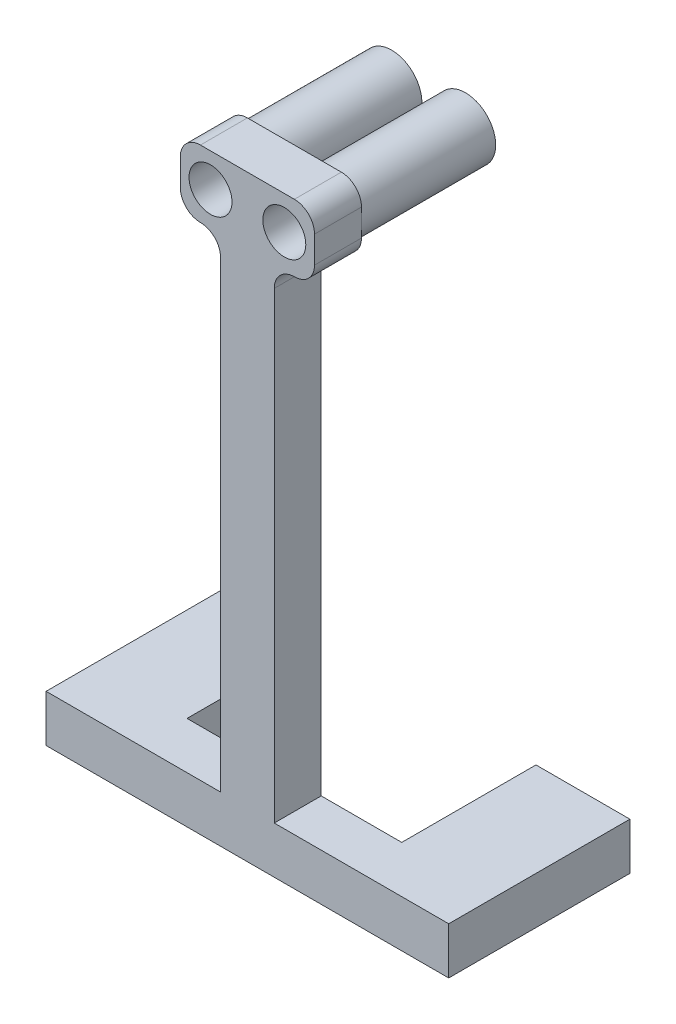
ISO-10303-21;
HEADER;
FILE_DESCRIPTION(('STEP AP214'),'2;1');
FILE_NAME('part.step','',(''),(''),'','','');
FILE_SCHEMA(('AUTOMOTIVE_DESIGN { 1 0 10303 214 1 1 1 1 }'));
ENDSEC;
DATA;
#1=APPLICATION_CONTEXT('core data for automotive mechanical design processes');
#2=APPLICATION_PROTOCOL_DEFINITION('international standard','automotive_design',2000,#1);
#3=PRODUCT_CONTEXT('',#1,'mechanical');
#4=PRODUCT('Part','Part','',(#3));
#5=PRODUCT_RELATED_PRODUCT_CATEGORY('part','',(#4));
#6=PRODUCT_DEFINITION_FORMATION('','',#4);
#7=PRODUCT_DEFINITION_CONTEXT('part definition',#1,'design');
#8=PRODUCT_DEFINITION('design','',#6,#7);
#9=PRODUCT_DEFINITION_SHAPE('','',#8);
#10=(LENGTH_UNIT() NAMED_UNIT(*) SI_UNIT(.MILLI.,.METRE.));
#11=(NAMED_UNIT(*) PLANE_ANGLE_UNIT() SI_UNIT($,.RADIAN.));
#12=(NAMED_UNIT(*) SI_UNIT($,.STERADIAN.) SOLID_ANGLE_UNIT());
#13=UNCERTAINTY_MEASURE_WITH_UNIT(LENGTH_MEASURE(1.E-05),#10,'distance_accuracy_value','');
#14=(GEOMETRIC_REPRESENTATION_CONTEXT(3) GLOBAL_UNCERTAINTY_ASSIGNED_CONTEXT((#13)) GLOBAL_UNIT_ASSIGNED_CONTEXT((#10,
#11,#12)) REPRESENTATION_CONTEXT('',''));
#15=CARTESIAN_POINT('',(0.,0.,0.));
#16=DIRECTION('',(0.,0.,1.));
#17=DIRECTION('',(1.,0.,0.));
#18=AXIS2_PLACEMENT_3D('',#15,#16,#17);
#19=CARTESIAN_POINT('',(0.,0.,0.));
#20=DIRECTION('',(0.,0.,1.));
#21=DIRECTION('',(1.,0.,0.));
#22=AXIS2_PLACEMENT_3D('',#19,#20,#21);
#23=PLANE('',#22);
#24=DIRECTION('',(0.,-1.,0.));
#25=VECTOR('',#24,1.);
#26=CARTESIAN_POINT('',(-20.32,-4.44500000000001,0.));
#27=LINE('',#26,#25);
#28=CARTESIAN_POINT('',(-20.32,4.44499999999999,0.));
#29=VERTEX_POINT('',#28);
#30=CARTESIAN_POINT('',(-20.32,-4.445,0.));
#31=VERTEX_POINT('',#30);
#32=EDGE_CURVE('E204',#29,#31,#27,.T.);
#33=ORIENTED_EDGE('',*,*,#32,.F.);
#34=DIRECTION('',(1.,0.,0.));
#35=VECTOR('',#34,1.);
#36=CARTESIAN_POINT('',(0.,4.445,0.));
#37=LINE('',#36,#35);
#38=CARTESIAN_POINT('',(-5.08000000000001,4.445,0.));
#39=VERTEX_POINT('',#38);
#40=EDGE_CURVE('E302',#29,#39,#37,.T.);
#41=ORIENTED_EDGE('',*,*,#40,.T.);
#42=DIRECTION('',(0.,-1.,0.));
#43=VECTOR('',#42,1.);
#44=CARTESIAN_POINT('',(-5.07999999999999,0.,0.));
#45=LINE('',#44,#43);
#46=CARTESIAN_POINT('',(-5.08000000000002,92.075,0.));
#47=VERTEX_POINT('',#46);
#48=EDGE_CURVE('E299',#47,#39,#45,.T.);
#49=ORIENTED_EDGE('',*,*,#48,.F.);
#50=CARTESIAN_POINT('',(-8.89000000000002,92.075,0.));
#51=DIRECTION('',(0.,0.,1.));
#52=DIRECTION('',(1.,0.,0.));
#53=AXIS2_PLACEMENT_3D('',#50,#51,#52);
#54=CIRCLE('',#53,3.81);
#55=CARTESIAN_POINT('',(-8.89000000000004,95.885,0.));
#56=VERTEX_POINT('',#55);
#57=EDGE_CURVE('E354',#47,#56,#54,.T.);
#58=ORIENTED_EDGE('',*,*,#57,.T.);
#59=CARTESIAN_POINT('',(-8.89000000000004,99.695,0.));
#60=DIRECTION('',(0.,0.,1.));
#61=DIRECTION('',(1.,0.,0.));
#62=AXIS2_PLACEMENT_3D('',#59,#60,#61);
#63=CIRCLE('',#62,3.81);
#64=CARTESIAN_POINT('',(-12.7,99.695,0.));
#65=VERTEX_POINT('',#64);
#66=EDGE_CURVE('E327',#56,#65,#63,.F.);
#67=ORIENTED_EDGE('',*,*,#66,.T.);
#68=DIRECTION('',(0.,-1.,0.));
#69=VECTOR('',#68,1.);
#70=CARTESIAN_POINT('',(-12.7000000000008,0.,0.));
#71=LINE('',#70,#69);
#72=CARTESIAN_POINT('',(-12.7,102.235,0.));
#73=VERTEX_POINT('',#72);
#74=EDGE_CURVE('E296',#73,#65,#71,.T.);
#75=ORIENTED_EDGE('',*,*,#74,.F.);
#76=CARTESIAN_POINT('',(-6.98500000000002,102.235,0.));
#77=DIRECTION('',(0.,0.,-1.));
#78=DIRECTION('',(-1.,0.,0.));
#79=AXIS2_PLACEMENT_3D('',#76,#77,#78);
#80=CIRCLE('',#79,5.71499999999999);
#81=EDGE_CURVE('E248',#73,#73,#80,.T.);
#82=ORIENTED_EDGE('',*,*,#81,.F.);
#83=CARTESIAN_POINT('',(-12.7,104.775,0.));
#84=VERTEX_POINT('',#83);
#85=EDGE_CURVE('E297',#84,#73,#71,.T.);
#86=ORIENTED_EDGE('',*,*,#85,.F.);
#87=CARTESIAN_POINT('',(-8.89,104.775,0.));
#88=DIRECTION('',(0.,0.,1.));
#89=DIRECTION('',(1.,0.,0.));
#90=AXIS2_PLACEMENT_3D('',#87,#88,#89);
#91=CIRCLE('',#90,3.81);
#92=CARTESIAN_POINT('',(-8.89,108.585,0.));
#93=VERTEX_POINT('',#92);
#94=EDGE_CURVE('E321',#84,#93,#91,.F.);
#95=ORIENTED_EDGE('',*,*,#94,.T.);
#96=DIRECTION('',(1.,0.,0.));
#97=VECTOR('',#96,1.);
#98=CARTESIAN_POINT('',(0.,108.585,0.));
#99=LINE('',#98,#97);
#100=CARTESIAN_POINT('',(8.89000000000003,108.585,0.));
#101=VERTEX_POINT('',#100);
#102=EDGE_CURVE('E293',#93,#101,#99,.T.);
#103=ORIENTED_EDGE('',*,*,#102,.T.);
#104=CARTESIAN_POINT('',(8.89000000000003,104.775,0.));
#105=DIRECTION('',(0.,0.,1.));
#106=DIRECTION('',(1.,0.,0.));
#107=AXIS2_PLACEMENT_3D('',#104,#105,#106);
#108=CIRCLE('',#107,3.81);
#109=CARTESIAN_POINT('',(12.7,104.775,0.));
#110=VERTEX_POINT('',#109);
#111=EDGE_CURVE('E323',#101,#110,#108,.F.);
#112=ORIENTED_EDGE('',*,*,#111,.T.);
#113=DIRECTION('',(0.,-1.,0.));
#114=VECTOR('',#113,1.);
#115=CARTESIAN_POINT('',(12.7,0.,0.));
#116=LINE('',#115,#114);
#117=CARTESIAN_POINT('',(12.7,102.235,0.));
#118=VERTEX_POINT('',#117);
#119=EDGE_CURVE('E291',#110,#118,#116,.T.);
#120=ORIENTED_EDGE('',*,*,#119,.T.);
#121=CARTESIAN_POINT('',(6.98499999999998,102.235,0.));
#122=DIRECTION('',(0.,0.,-1.));
#123=DIRECTION('',(-1.,0.,0.));
#124=AXIS2_PLACEMENT_3D('',#121,#122,#123);
#125=CIRCLE('',#124,5.71500000000001);
#126=EDGE_CURVE('E249',#118,#118,#125,.T.);
#127=ORIENTED_EDGE('',*,*,#126,.F.);
#128=CARTESIAN_POINT('',(12.7,99.695,0.));
#129=VERTEX_POINT('',#128);
#130=EDGE_CURVE('E290',#118,#129,#116,.T.);
#131=ORIENTED_EDGE('',*,*,#130,.T.);
#132=CARTESIAN_POINT('',(8.89000000000003,99.695,0.));
#133=DIRECTION('',(0.,0.,1.));
#134=DIRECTION('',(1.,0.,0.));
#135=AXIS2_PLACEMENT_3D('',#132,#133,#134);
#136=CIRCLE('',#135,3.81);
#137=CARTESIAN_POINT('',(8.89000000000003,95.885,0.));
#138=VERTEX_POINT('',#137);
#139=EDGE_CURVE('E325',#129,#138,#136,.F.);
#140=ORIENTED_EDGE('',*,*,#139,.T.);
#141=CARTESIAN_POINT('',(8.88999999999998,92.075,0.));
#142=DIRECTION('',(0.,0.,1.));
#143=DIRECTION('',(1.,0.,0.));
#144=AXIS2_PLACEMENT_3D('',#141,#142,#143);
#145=CIRCLE('',#144,3.81);
#146=CARTESIAN_POINT('',(5.07999999999998,92.075,0.));
#147=VERTEX_POINT('',#146);
#148=EDGE_CURVE('E43',#138,#147,#145,.T.);
#149=ORIENTED_EDGE('',*,*,#148,.T.);
#150=DIRECTION('',(0.,-1.,0.));
#151=VECTOR('',#150,1.);
#152=CARTESIAN_POINT('',(5.08,0.,0.));
#153=LINE('',#152,#151);
#154=CARTESIAN_POINT('',(5.07999999999999,4.445,0.));
#155=VERTEX_POINT('',#154);
#156=EDGE_CURVE('E256',#147,#155,#153,.T.);
#157=ORIENTED_EDGE('',*,*,#156,.T.);
#158=CARTESIAN_POINT('',(20.32,4.445,0.));
#159=VERTEX_POINT('',#158);
#160=EDGE_CURVE('E262',#155,#159,#37,.T.);
#161=ORIENTED_EDGE('',*,*,#160,.T.);
#162=DIRECTION('',(0.,1.,0.));
#163=VECTOR('',#162,1.);
#164=CARTESIAN_POINT('',(20.32,4.44500000000001,0.));
#165=LINE('',#164,#163);
#166=CARTESIAN_POINT('',(20.32,-4.44499999999999,0.));
#167=VERTEX_POINT('',#166);
#168=EDGE_CURVE('E212',#167,#159,#165,.T.);
#169=ORIENTED_EDGE('',*,*,#168,.F.);
#170=DIRECTION('',(1.,0.,0.));
#171=VECTOR('',#170,1.);
#172=CARTESIAN_POINT('',(0.,-4.445,0.));
#173=LINE('',#172,#171);
#174=EDGE_CURVE('E56',#31,#167,#173,.T.);
#175=ORIENTED_EDGE('',*,*,#174,.F.);
#176=EDGE_LOOP('',(#33,#41,#49,#58,#67,#75,#82,#86,#95,#103,#112,#120,#127,#131,#140,#149,#157,
#161,#169,#175));
#177=FACE_BOUND('',#176,.T.);
#178=ADVANCED_FACE('F34',(#177),#23,.F.);
#179=CARTESIAN_POINT('',(5.08,0.,8.89));
#180=DIRECTION('',(1.,0.,0.));
#181=DIRECTION('',(0.,1.,0.));
#182=AXIS2_PLACEMENT_3D('',#179,#180,#181);
#183=PLANE('',#182);
#184=ORIENTED_EDGE('',*,*,#156,.F.);
#185=DIRECTION('',(0.,0.,-1.));
#186=VECTOR('',#185,1.);
#187=CARTESIAN_POINT('',(5.07999999999998,92.075,8.89));
#188=LINE('',#187,#186);
#189=CARTESIAN_POINT('',(5.07999999999998,92.075,8.89));
#190=VERTEX_POINT('',#189);
#191=EDGE_CURVE('E342',#147,#190,#188,.F.);
#192=ORIENTED_EDGE('',*,*,#191,.T.);
#193=DIRECTION('',(0.,-1.,0.));
#194=VECTOR('',#193,1.);
#195=CARTESIAN_POINT('',(5.08,0.,8.89));
#196=LINE('',#195,#194);
#197=CARTESIAN_POINT('',(5.07999999999999,4.445,8.89));
#198=VERTEX_POINT('',#197);
#199=EDGE_CURVE('E259',#190,#198,#196,.T.);
#200=ORIENTED_EDGE('',*,*,#199,.T.);
#201=DIRECTION('',(0.,0.,-1.));
#202=VECTOR('',#201,1.);
#203=CARTESIAN_POINT('',(5.07999999999999,4.445,8.89));
#204=LINE('',#203,#202);
#205=EDGE_CURVE('E288',#198,#155,#204,.T.);
#206=ORIENTED_EDGE('',*,*,#205,.T.);
#207=EDGE_LOOP('',(#184,#192,#200,#206));
#208=FACE_BOUND('',#207,.T.);
#209=ADVANCED_FACE('F433',(#208),#183,.T.);
#210=CARTESIAN_POINT('',(12.7,0.,8.89));
#211=DIRECTION('',(1.,0.,0.));
#212=DIRECTION('',(0.,1.,0.));
#213=AXIS2_PLACEMENT_3D('',#210,#211,#212);
#214=PLANE('',#213);
#215=DIRECTION('',(0.,-1.,0.));
#216=VECTOR('',#215,1.);
#217=CARTESIAN_POINT('',(12.7,0.,8.89));
#218=LINE('',#217,#216);
#219=CARTESIAN_POINT('',(12.7,104.775,8.89));
#220=VERTEX_POINT('',#219);
#221=CARTESIAN_POINT('',(12.7,99.695,8.89));
#222=VERTEX_POINT('',#221);
#223=EDGE_CURVE('E261',#220,#222,#218,.T.);
#224=ORIENTED_EDGE('',*,*,#223,.T.);
#225=DIRECTION('',(0.,0.,-1.));
#226=VECTOR('',#225,1.);
#227=CARTESIAN_POINT('',(12.7,99.695,0.));
#228=LINE('',#227,#226);
#229=EDGE_CURVE('E347',#222,#129,#228,.T.);
#230=ORIENTED_EDGE('',*,*,#229,.T.);
#231=ORIENTED_EDGE('',*,*,#130,.F.);
#232=ORIENTED_EDGE('',*,*,#119,.F.);
#233=DIRECTION('',(0.,0.,-1.));
#234=VECTOR('',#233,1.);
#235=CARTESIAN_POINT('',(12.7,104.775,8.89));
#236=LINE('',#235,#234);
#237=EDGE_CURVE('E345',#110,#220,#236,.F.);
#238=ORIENTED_EDGE('',*,*,#237,.T.);
#239=EDGE_LOOP('',(#224,#230,#231,#232,#238));
#240=FACE_BOUND('',#239,.T.);
#241=ADVANCED_FACE('F380',(#240),#214,.T.);
#242=CARTESIAN_POINT('',(0.,108.585,8.89));
#243=DIRECTION('',(0.,1.,0.));
#244=DIRECTION('',(0.,0.,1.));
#245=AXIS2_PLACEMENT_3D('',#242,#243,#244);
#246=PLANE('',#245);
#247=DIRECTION('',(1.,0.,0.));
#248=VECTOR('',#247,1.);
#249=CARTESIAN_POINT('',(0.,108.585,8.89));
#250=LINE('',#249,#248);
#251=CARTESIAN_POINT('',(-8.89,108.585,8.89));
#252=VERTEX_POINT('',#251);
#253=CARTESIAN_POINT('',(8.89000000000003,108.585,8.89));
#254=VERTEX_POINT('',#253);
#255=EDGE_CURVE('E265',#252,#254,#250,.T.);
#256=ORIENTED_EDGE('',*,*,#255,.T.);
#257=DIRECTION('',(0.,0.,-1.));
#258=VECTOR('',#257,1.);
#259=CARTESIAN_POINT('',(8.89000000000003,108.585,8.89));
#260=LINE('',#259,#258);
#261=EDGE_CURVE('E351',#254,#101,#260,.T.);
#262=ORIENTED_EDGE('',*,*,#261,.T.);
#263=ORIENTED_EDGE('',*,*,#102,.F.);
#264=DIRECTION('',(0.,0.,-1.));
#265=VECTOR('',#264,1.);
#266=CARTESIAN_POINT('',(-8.89,108.585,8.89));
#267=LINE('',#266,#265);
#268=EDGE_CURVE('E349',#93,#252,#267,.F.);
#269=ORIENTED_EDGE('',*,*,#268,.T.);
#270=EDGE_LOOP('',(#256,#262,#263,#269));
#271=FACE_BOUND('',#270,.T.);
#272=ADVANCED_FACE('F391',(#271),#246,.T.);
#273=CARTESIAN_POINT('',(-12.7000000000008,0.,8.89));
#274=DIRECTION('',(1.,0.,0.));
#275=DIRECTION('',(0.,1.,0.));
#276=AXIS2_PLACEMENT_3D('',#273,#274,#275);
#277=PLANE('',#276);
#278=ORIENTED_EDGE('',*,*,#74,.T.);
#279=DIRECTION('',(0.,0.,-1.));
#280=VECTOR('',#279,1.);
#281=CARTESIAN_POINT('',(-12.7,99.695,8.89));
#282=LINE('',#281,#280);
#283=CARTESIAN_POINT('',(-12.7,99.695,8.89));
#284=VERTEX_POINT('',#283);
#285=EDGE_CURVE('E332',#65,#284,#282,.F.);
#286=ORIENTED_EDGE('',*,*,#285,.T.);
#287=DIRECTION('',(0.,-1.,0.));
#288=VECTOR('',#287,1.);
#289=CARTESIAN_POINT('',(-12.7000000000008,0.,8.89));
#290=LINE('',#289,#288);
#291=CARTESIAN_POINT('',(-12.7,104.775,8.89));
#292=VERTEX_POINT('',#291);
#293=EDGE_CURVE('E268',#292,#284,#290,.T.);
#294=ORIENTED_EDGE('',*,*,#293,.F.);
#295=DIRECTION('',(0.,0.,-1.));
#296=VECTOR('',#295,1.);
#297=CARTESIAN_POINT('',(-12.7,104.775,0.));
#298=LINE('',#297,#296);
#299=EDGE_CURVE('E329',#292,#84,#298,.T.);
#300=ORIENTED_EDGE('',*,*,#299,.T.);
#301=ORIENTED_EDGE('',*,*,#85,.T.);
#302=EDGE_LOOP('',(#278,#286,#294,#300,#301));
#303=FACE_BOUND('',#302,.T.);
#304=ADVANCED_FACE('F400',(#303),#277,.F.);
#305=CARTESIAN_POINT('',(-5.07999999999999,0.,8.89));
#306=DIRECTION('',(1.,0.,0.));
#307=DIRECTION('',(0.,1.,0.));
#308=AXIS2_PLACEMENT_3D('',#305,#306,#307);
#309=PLANE('',#308);
#310=DIRECTION('',(0.,-1.,0.));
#311=VECTOR('',#310,1.);
#312=CARTESIAN_POINT('',(-5.07999999999999,0.,8.89));
#313=LINE('',#312,#311);
#314=CARTESIAN_POINT('',(-5.08000000000002,92.075,8.89));
#315=VERTEX_POINT('',#314);
#316=CARTESIAN_POINT('',(-5.08000000000001,4.445,8.89));
#317=VERTEX_POINT('',#316);
#318=EDGE_CURVE('E271',#315,#317,#313,.T.);
#319=ORIENTED_EDGE('',*,*,#318,.F.);
#320=DIRECTION('',(0.,0.,-1.));
#321=VECTOR('',#320,1.);
#322=CARTESIAN_POINT('',(-5.08000000000002,92.075,0.));
#323=LINE('',#322,#321);
#324=EDGE_CURVE('E318',#315,#47,#323,.T.);
#325=ORIENTED_EDGE('',*,*,#324,.T.);
#326=ORIENTED_EDGE('',*,*,#48,.T.);
#327=DIRECTION('',(0.,0.,-1.));
#328=VECTOR('',#327,1.);
#329=CARTESIAN_POINT('',(-5.08000000000001,4.445,8.89));
#330=LINE('',#329,#328);
#331=EDGE_CURVE('E189',#317,#39,#330,.T.);
#332=ORIENTED_EDGE('',*,*,#331,.F.);
#333=EDGE_LOOP('',(#319,#325,#326,#332));
#334=FACE_BOUND('',#333,.T.);
#335=ADVANCED_FACE('F411',(#334),#309,.F.);
#336=CARTESIAN_POINT('',(0.,4.445,8.89));
#337=DIRECTION('',(0.,1.,0.));
#338=DIRECTION('',(-1.,0.,0.));
#339=AXIS2_PLACEMENT_3D('',#336,#337,#338);
#340=PLANE('',#339);
#341=ORIENTED_EDGE('',*,*,#40,.F.);
#342=DIRECTION('',(0.,0.,1.));
#343=VECTOR('',#342,1.);
#344=CARTESIAN_POINT('',(-20.32,4.44499999999999,-25.4));
#345=LINE('',#344,#343);
#346=CARTESIAN_POINT('',(-20.32,4.44499999999999,-25.4));
#347=VERTEX_POINT('',#346);
#348=EDGE_CURVE('E196',#347,#29,#345,.T.);
#349=ORIENTED_EDGE('',*,*,#348,.F.);
#350=DIRECTION('',(1.,0.,0.));
#351=VECTOR('',#350,1.);
#352=CARTESIAN_POINT('',(-38.1,4.44499999999999,-25.4));
#353=LINE('',#352,#351);
#354=CARTESIAN_POINT('',(-38.1,4.44499999999999,-25.4));
#355=VERTEX_POINT('',#354);
#356=EDGE_CURVE('E193',#355,#347,#353,.T.);
#357=ORIENTED_EDGE('',*,*,#356,.F.);
#358=DIRECTION('',(0.,0.,-1.));
#359=VECTOR('',#358,1.);
#360=CARTESIAN_POINT('',(-38.1,4.44499999999999,8.89));
#361=LINE('',#360,#359);
#362=CARTESIAN_POINT('',(-38.1,4.44499999999999,8.89));
#363=VERTEX_POINT('',#362);
#364=EDGE_CURVE('E179',#363,#355,#361,.T.);
#365=ORIENTED_EDGE('',*,*,#364,.F.);
#366=DIRECTION('',(1.,0.,0.));
#367=VECTOR('',#366,1.);
#368=CARTESIAN_POINT('',(0.,4.445,8.89));
#369=LINE('',#368,#367);
#370=EDGE_CURVE('E273',#363,#317,#369,.T.);
#371=ORIENTED_EDGE('',*,*,#370,.T.);
#372=ORIENTED_EDGE('',*,*,#331,.T.);
#373=EDGE_LOOP('',(#341,#349,#357,#365,#371,#372));
#374=FACE_BOUND('',#373,.T.);
#375=ADVANCED_FACE('F195',(#374),#340,.T.);
#376=CARTESIAN_POINT('',(-38.1,0.,8.89));
#377=DIRECTION('',(1.,0.,0.));
#378=DIRECTION('',(0.,0.,-1.));
#379=AXIS2_PLACEMENT_3D('',#376,#377,#378);
#380=PLANE('',#379);
#381=ORIENTED_EDGE('',*,*,#364,.T.);
#382=DIRECTION('',(0.,1.,0.));
#383=VECTOR('',#382,1.);
#384=CARTESIAN_POINT('',(-38.1,-4.44500000000001,-25.4));
#385=LINE('',#384,#383);
#386=CARTESIAN_POINT('',(-38.1,-4.44500000000001,-25.4));
#387=VERTEX_POINT('',#386);
#388=EDGE_CURVE('E184',#387,#355,#385,.T.);
#389=ORIENTED_EDGE('',*,*,#388,.F.);
#390=DIRECTION('',(0.,0.,-1.));
#391=VECTOR('',#390,1.);
#392=CARTESIAN_POINT('',(-38.1,-4.44500000000001,8.89));
#393=LINE('',#392,#391);
#394=CARTESIAN_POINT('',(-38.1,-4.44500000000001,8.89));
#395=VERTEX_POINT('',#394);
#396=EDGE_CURVE('E190',#395,#387,#393,.T.);
#397=ORIENTED_EDGE('',*,*,#396,.F.);
#398=DIRECTION('',(0.,-1.,0.));
#399=VECTOR('',#398,1.);
#400=CARTESIAN_POINT('',(-38.1,0.,8.89));
#401=LINE('',#400,#399);
#402=EDGE_CURVE('E185',#363,#395,#401,.T.);
#403=ORIENTED_EDGE('',*,*,#402,.F.);
#404=EDGE_LOOP('',(#381,#389,#397,#403));
#405=FACE_BOUND('',#404,.T.);
#406=ADVANCED_FACE('F181',(#405),#380,.F.);
#407=CARTESIAN_POINT('',(0.,-4.445,8.89));
#408=DIRECTION('',(0.,1.,0.));
#409=DIRECTION('',(-1.,0.,0.));
#410=AXIS2_PLACEMENT_3D('',#407,#408,#409);
#411=PLANE('',#410);
#412=ORIENTED_EDGE('',*,*,#396,.T.);
#413=DIRECTION('',(-1.,0.,0.));
#414=VECTOR('',#413,1.);
#415=CARTESIAN_POINT('',(-38.1,-4.44500000000001,-25.4));
#416=LINE('',#415,#414);
#417=CARTESIAN_POINT('',(-20.32,-4.44500000000001,-25.4));
#418=VERTEX_POINT('',#417);
#419=EDGE_CURVE('E203',#418,#387,#416,.T.);
#420=ORIENTED_EDGE('',*,*,#419,.F.);
#421=DIRECTION('',(0.,0.,1.));
#422=VECTOR('',#421,1.);
#423=CARTESIAN_POINT('',(-20.32,-4.44500000000001,-25.4));
#424=LINE('',#423,#422);
#425=EDGE_CURVE('E51',#418,#31,#424,.T.);
#426=ORIENTED_EDGE('',*,*,#425,.T.);
#427=ORIENTED_EDGE('',*,*,#174,.T.);
#428=DIRECTION('',(0.,0.,1.));
#429=VECTOR('',#428,1.);
#430=CARTESIAN_POINT('',(20.32,-4.44500000000001,-25.4));
#431=LINE('',#430,#429);
#432=CARTESIAN_POINT('',(20.32,-4.44500000000001,-25.4));
#433=VERTEX_POINT('',#432);
#434=EDGE_CURVE('E228',#433,#167,#431,.T.);
#435=ORIENTED_EDGE('',*,*,#434,.F.);
#436=DIRECTION('',(-1.,0.,0.));
#437=VECTOR('',#436,1.);
#438=CARTESIAN_POINT('',(38.1,-4.44500000000001,-25.4));
#439=LINE('',#438,#437);
#440=CARTESIAN_POINT('',(38.1,-4.44500000000001,-25.4));
#441=VERTEX_POINT('',#440);
#442=EDGE_CURVE('E216',#441,#433,#439,.T.);
#443=ORIENTED_EDGE('',*,*,#442,.F.);
#444=DIRECTION('',(0.,0.,-1.));
#445=VECTOR('',#444,1.);
#446=CARTESIAN_POINT('',(38.1,-4.44499999999999,8.89));
#447=LINE('',#446,#445);
#448=CARTESIAN_POINT('',(38.1,-4.44499999999999,8.89));
#449=VERTEX_POINT('',#448);
#450=EDGE_CURVE('E313',#449,#441,#447,.T.);
#451=ORIENTED_EDGE('',*,*,#450,.F.);
#452=DIRECTION('',(1.,0.,0.));
#453=VECTOR('',#452,1.);
#454=CARTESIAN_POINT('',(0.,-4.445,8.89));
#455=LINE('',#454,#453);
#456=EDGE_CURVE('E277',#395,#449,#455,.T.);
#457=ORIENTED_EDGE('',*,*,#456,.F.);
#458=EDGE_LOOP('',(#412,#420,#426,#427,#435,#443,#451,#457));
#459=FACE_BOUND('',#458,.T.);
#460=ADVANCED_FACE('F419',(#459),#411,.F.);
#461=CARTESIAN_POINT('',(38.1,0.,8.89));
#462=DIRECTION('',(1.,0.,0.));
#463=DIRECTION('',(0.,0.,-1.));
#464=AXIS2_PLACEMENT_3D('',#461,#462,#463);
#465=PLANE('',#464);
#466=ORIENTED_EDGE('',*,*,#450,.T.);
#467=DIRECTION('',(0.,-1.,0.));
#468=VECTOR('',#467,1.);
#469=CARTESIAN_POINT('',(38.1,4.44500000000001,-25.4));
#470=LINE('',#469,#468);
#471=CARTESIAN_POINT('',(38.1,4.44500000000001,-25.4));
#472=VERTEX_POINT('',#471);
#473=EDGE_CURVE('E213',#472,#441,#470,.T.);
#474=ORIENTED_EDGE('',*,*,#473,.F.);
#475=DIRECTION('',(0.,0.,-1.));
#476=VECTOR('',#475,1.);
#477=CARTESIAN_POINT('',(38.1,4.44500000000001,8.89));
#478=LINE('',#477,#476);
#479=CARTESIAN_POINT('',(38.1,4.44500000000001,8.89));
#480=VERTEX_POINT('',#479);
#481=EDGE_CURVE('E311',#480,#472,#478,.T.);
#482=ORIENTED_EDGE('',*,*,#481,.F.);
#483=DIRECTION('',(0.,-1.,0.));
#484=VECTOR('',#483,1.);
#485=CARTESIAN_POINT('',(38.1,0.,8.89));
#486=LINE('',#485,#484);
#487=EDGE_CURVE('E279',#480,#449,#486,.T.);
#488=ORIENTED_EDGE('',*,*,#487,.T.);
#489=EDGE_LOOP('',(#466,#474,#482,#488));
#490=FACE_BOUND('',#489,.T.);
#491=ADVANCED_FACE('F423',(#490),#465,.T.);
#492=CARTESIAN_POINT('',(6.98499999999998,102.235,8.89));
#493=DIRECTION('',(0.,0.,-1.));
#494=DIRECTION('',(-1.,0.,0.));
#495=AXIS2_PLACEMENT_3D('',#492,#493,#494);
#496=CYLINDRICAL_SURFACE('',#495,4.06399999999999);
#497=CARTESIAN_POINT('',(6.98499999999998,102.235,8.89));
#498=DIRECTION('',(0.,0.,1.));
#499=DIRECTION('',(1.,0.,0.));
#500=AXIS2_PLACEMENT_3D('',#497,#498,#499);
#501=CIRCLE('',#500,4.06399999999999);
#502=CARTESIAN_POINT('',(11.049,102.235,8.89));
#503=VERTEX_POINT('',#502);
#504=EDGE_CURVE('E282',#503,#503,#501,.T.);
#505=ORIENTED_EDGE('',*,*,#504,.T.);
#506=EDGE_LOOP('',(#505));
#507=FACE_BOUND('',#506,.T.);
#508=CARTESIAN_POINT('',(6.98499999999998,102.235,0.));
#509=DIRECTION('',(0.,0.,1.));
#510=DIRECTION('',(1.,0.,0.));
#511=AXIS2_PLACEMENT_3D('',#508,#509,#510);
#512=CIRCLE('',#511,4.06399999999999);
#513=CARTESIAN_POINT('',(11.049,102.235,0.));
#514=VERTEX_POINT('',#513);
#515=EDGE_CURVE('E234',#514,#514,#512,.T.);
#516=ORIENTED_EDGE('',*,*,#515,.F.);
#517=EDGE_LOOP('',(#516));
#518=FACE_BOUND('',#517,.T.);
#519=ADVANCED_FACE('F467',(#507,#518),#496,.F.);
#520=ORIENTED_EDGE('',*,*,#160,.F.);
#521=ORIENTED_EDGE('',*,*,#205,.F.);
#522=EDGE_CURVE('E275',#198,#480,#369,.T.);
#523=ORIENTED_EDGE('',*,*,#522,.T.);
#524=ORIENTED_EDGE('',*,*,#481,.T.);
#525=DIRECTION('',(1.,0.,0.));
#526=VECTOR('',#525,1.);
#527=CARTESIAN_POINT('',(38.1,4.44500000000001,-25.4));
#528=LINE('',#527,#526);
#529=CARTESIAN_POINT('',(20.32,4.44500000000001,-25.4));
#530=VERTEX_POINT('',#529);
#531=EDGE_CURVE('E220',#530,#472,#528,.T.);
#532=ORIENTED_EDGE('',*,*,#531,.F.);
#533=DIRECTION('',(0.,0.,1.));
#534=VECTOR('',#533,1.);
#535=CARTESIAN_POINT('',(20.32,4.44500000000001,-25.4));
#536=LINE('',#535,#534);
#537=EDGE_CURVE('E223',#530,#159,#536,.T.);
#538=ORIENTED_EDGE('',*,*,#537,.T.);
#539=EDGE_LOOP('',(#520,#521,#523,#524,#532,#538));
#540=FACE_BOUND('',#539,.T.);
#541=ADVANCED_FACE('F429',(#540),#340,.T.);
#542=CARTESIAN_POINT('',(-6.98500000000002,102.235,8.89));
#543=DIRECTION('',(0.,0.,-1.));
#544=DIRECTION('',(-1.,0.,0.));
#545=AXIS2_PLACEMENT_3D('',#542,#543,#544);
#546=CYLINDRICAL_SURFACE('',#545,4.06399999999998);
#547=CARTESIAN_POINT('',(-6.98500000000002,102.235,8.89));
#548=DIRECTION('',(0.,0.,1.));
#549=DIRECTION('',(1.,0.,0.));
#550=AXIS2_PLACEMENT_3D('',#547,#548,#549);
#551=CIRCLE('',#550,4.06399999999998);
#552=CARTESIAN_POINT('',(-2.92100000000004,102.235,8.89));
#553=VERTEX_POINT('',#552);
#554=EDGE_CURVE('E285',#553,#553,#551,.T.);
#555=ORIENTED_EDGE('',*,*,#554,.T.);
#556=EDGE_LOOP('',(#555));
#557=FACE_BOUND('',#556,.T.);
#558=CARTESIAN_POINT('',(-6.98500000000002,102.235,0.));
#559=DIRECTION('',(0.,0.,1.));
#560=DIRECTION('',(1.,0.,0.));
#561=AXIS2_PLACEMENT_3D('',#558,#559,#560);
#562=CIRCLE('',#561,4.06399999999998);
#563=CARTESIAN_POINT('',(-2.92100000000004,102.235,0.));
#564=VERTEX_POINT('',#563);
#565=EDGE_CURVE('E252',#564,#564,#562,.T.);
#566=ORIENTED_EDGE('',*,*,#565,.F.);
#567=EDGE_LOOP('',(#566));
#568=FACE_BOUND('',#567,.T.);
#569=ADVANCED_FACE('F463',(#557,#568),#546,.F.);
#570=CARTESIAN_POINT('',(0.,0.,8.89));
#571=DIRECTION('',(0.,0.,1.));
#572=DIRECTION('',(1.,0.,0.));
#573=AXIS2_PLACEMENT_3D('',#570,#571,#572);
#574=PLANE('',#573);
#575=ORIENTED_EDGE('',*,*,#293,.T.);
#576=CARTESIAN_POINT('',(-8.89000000000004,99.695,8.89));
#577=DIRECTION('',(0.,0.,1.));
#578=DIRECTION('',(1.,0.,0.));
#579=AXIS2_PLACEMENT_3D('',#576,#577,#578);
#580=CIRCLE('',#579,3.81);
#581=CARTESIAN_POINT('',(-8.89000000000004,95.885,8.89));
#582=VERTEX_POINT('',#581);
#583=EDGE_CURVE('E340',#284,#582,#580,.T.);
#584=ORIENTED_EDGE('',*,*,#583,.T.);
#585=CARTESIAN_POINT('',(-8.89000000000002,92.075,8.89));
#586=DIRECTION('',(0.,0.,1.));
#587=DIRECTION('',(1.,0.,0.));
#588=AXIS2_PLACEMENT_3D('',#585,#586,#587);
#589=CIRCLE('',#588,3.81);
#590=EDGE_CURVE('E356',#582,#315,#589,.F.);
#591=ORIENTED_EDGE('',*,*,#590,.T.);
#592=ORIENTED_EDGE('',*,*,#318,.T.);
#593=ORIENTED_EDGE('',*,*,#370,.F.);
#594=ORIENTED_EDGE('',*,*,#402,.T.);
#595=ORIENTED_EDGE('',*,*,#456,.T.);
#596=ORIENTED_EDGE('',*,*,#487,.F.);
#597=ORIENTED_EDGE('',*,*,#522,.F.);
#598=ORIENTED_EDGE('',*,*,#199,.F.);
#599=CARTESIAN_POINT('',(8.88999999999998,92.075,8.89));
#600=DIRECTION('',(0.,0.,1.));
#601=DIRECTION('',(1.,0.,0.));
#602=AXIS2_PLACEMENT_3D('',#599,#600,#601);
#603=CIRCLE('',#602,3.81);
#604=CARTESIAN_POINT('',(8.89000000000003,95.885,8.89));
#605=VERTEX_POINT('',#604);
#606=EDGE_CURVE('E11',#190,#605,#603,.F.);
#607=ORIENTED_EDGE('',*,*,#606,.T.);
#608=CARTESIAN_POINT('',(8.89000000000003,99.695,8.89));
#609=DIRECTION('',(0.,0.,1.));
#610=DIRECTION('',(1.,0.,0.));
#611=AXIS2_PLACEMENT_3D('',#608,#609,#610);
#612=CIRCLE('',#611,3.81);
#613=EDGE_CURVE('E338',#605,#222,#612,.T.);
#614=ORIENTED_EDGE('',*,*,#613,.T.);
#615=ORIENTED_EDGE('',*,*,#223,.F.);
#616=CARTESIAN_POINT('',(8.89000000000003,104.775,8.89));
#617=DIRECTION('',(0.,0.,1.));
#618=DIRECTION('',(1.,0.,0.));
#619=AXIS2_PLACEMENT_3D('',#616,#617,#618);
#620=CIRCLE('',#619,3.81);
#621=EDGE_CURVE('E336',#220,#254,#620,.T.);
#622=ORIENTED_EDGE('',*,*,#621,.T.);
#623=ORIENTED_EDGE('',*,*,#255,.F.);
#624=CARTESIAN_POINT('',(-8.89,104.775,8.89));
#625=DIRECTION('',(0.,0.,1.));
#626=DIRECTION('',(1.,0.,0.));
#627=AXIS2_PLACEMENT_3D('',#624,#625,#626);
#628=CIRCLE('',#627,3.81);
#629=EDGE_CURVE('E334',#252,#292,#628,.T.);
#630=ORIENTED_EDGE('',*,*,#629,.T.);
#631=EDGE_LOOP('',(#575,#584,#591,#592,#593,#594,#595,#596,#597,#598,#607,#614,#615,#622,#623,#630));
#632=FACE_BOUND('',#631,.T.);
#633=ORIENTED_EDGE('',*,*,#504,.F.);
#634=EDGE_LOOP('',(#633));
#635=FACE_BOUND('',#634,.T.);
#636=ORIENTED_EDGE('',*,*,#554,.F.);
#637=EDGE_LOOP('',(#636));
#638=FACE_BOUND('',#637,.T.);
#639=ADVANCED_FACE('F375',(#632,#635,#638),#574,.T.);
#640=CARTESIAN_POINT('',(-6.98500000000002,102.235,-25.4));
#641=DIRECTION('',(0.,0.,-1.));
#642=DIRECTION('',(-1.,0.,0.));
#643=AXIS2_PLACEMENT_3D('',#640,#641,#642);
#644=PLANE('',#643);
#645=CARTESIAN_POINT('',(-6.98500000000002,102.235,-25.4));
#646=DIRECTION('',(0.,0.,-1.));
#647=DIRECTION('',(-1.,0.,0.));
#648=AXIS2_PLACEMENT_3D('',#645,#646,#647);
#649=CIRCLE('',#648,4.445);
#650=CARTESIAN_POINT('',(-11.43,102.235,-25.4));
#651=VERTEX_POINT('',#650);
#652=EDGE_CURVE('E235',#651,#651,#649,.T.);
#653=ORIENTED_EDGE('',*,*,#652,.F.);
#654=EDGE_LOOP('',(#653));
#655=FACE_BOUND('',#654,.T.);
#656=CARTESIAN_POINT('',(-6.98500000000002,102.235,-25.4));
#657=DIRECTION('',(0.,0.,-1.));
#658=DIRECTION('',(-1.,0.,0.));
#659=AXIS2_PLACEMENT_3D('',#656,#657,#658);
#660=CIRCLE('',#659,5.71499999999999);
#661=CARTESIAN_POINT('',(-12.7,102.235,-25.4));
#662=VERTEX_POINT('',#661);
#663=EDGE_CURVE('E253',#662,#662,#660,.T.);
#664=ORIENTED_EDGE('',*,*,#663,.T.);
#665=EDGE_LOOP('',(#664));
#666=FACE_BOUND('',#665,.T.);
#667=ADVANCED_FACE('F652',(#655,#666),#644,.T.);
#668=CARTESIAN_POINT('',(-6.98500000000002,102.235,-25.4));
#669=DIRECTION('',(0.,0.,1.));
#670=DIRECTION('',(1.,0.,0.));
#671=AXIS2_PLACEMENT_3D('',#668,#669,#670);
#672=CYLINDRICAL_SURFACE('',#671,5.71499999999999);
#673=ORIENTED_EDGE('',*,*,#663,.F.);
#674=EDGE_LOOP('',(#673));
#675=FACE_BOUND('',#674,.T.);
#676=ORIENTED_EDGE('',*,*,#81,.T.);
#677=EDGE_LOOP('',(#676));
#678=FACE_BOUND('',#677,.T.);
#679=ADVANCED_FACE('F449',(#675,#678),#672,.T.);
#680=CARTESIAN_POINT('',(6.98499999999998,102.235,-25.4));
#681=DIRECTION('',(0.,0.,-1.));
#682=DIRECTION('',(-1.,0.,0.));
#683=AXIS2_PLACEMENT_3D('',#680,#681,#682);
#684=PLANE('',#683);
#685=CARTESIAN_POINT('',(6.98499999999998,102.235,-25.4));
#686=DIRECTION('',(0.,0.,-1.));
#687=DIRECTION('',(-1.,0.,0.));
#688=AXIS2_PLACEMENT_3D('',#685,#686,#687);
#689=CIRCLE('',#688,4.445);
#690=CARTESIAN_POINT('',(2.53999999999998,102.235,-25.4));
#691=VERTEX_POINT('',#690);
#692=EDGE_CURVE('E241',#691,#691,#689,.T.);
#693=ORIENTED_EDGE('',*,*,#692,.F.);
#694=EDGE_LOOP('',(#693));
#695=FACE_BOUND('',#694,.T.);
#696=CARTESIAN_POINT('',(6.98499999999998,102.235,-25.4));
#697=DIRECTION('',(0.,0.,-1.));
#698=DIRECTION('',(-1.,0.,0.));
#699=AXIS2_PLACEMENT_3D('',#696,#697,#698);
#700=CIRCLE('',#699,5.71500000000001);
#701=CARTESIAN_POINT('',(1.26999999999997,102.235,-25.4));
#702=VERTEX_POINT('',#701);
#703=EDGE_CURVE('E245',#702,#702,#700,.T.);
#704=ORIENTED_EDGE('',*,*,#703,.T.);
#705=EDGE_LOOP('',(#704));
#706=FACE_BOUND('',#705,.T.);
#707=ADVANCED_FACE('F439',(#695,#706),#684,.T.);
#708=CARTESIAN_POINT('',(6.98499999999998,102.235,-25.4));
#709=DIRECTION('',(0.,0.,1.));
#710=DIRECTION('',(1.,0.,0.));
#711=AXIS2_PLACEMENT_3D('',#708,#709,#710);
#712=CYLINDRICAL_SURFACE('',#711,5.71500000000001);
#713=ORIENTED_EDGE('',*,*,#703,.F.);
#714=EDGE_LOOP('',(#713));
#715=FACE_BOUND('',#714,.T.);
#716=ORIENTED_EDGE('',*,*,#126,.T.);
#717=EDGE_LOOP('',(#716));
#718=FACE_BOUND('',#717,.T.);
#719=ADVANCED_FACE('F436',(#715,#718),#712,.T.);
#720=CARTESIAN_POINT('',(6.98499999999998,102.235,0.));
#721=DIRECTION('',(0.,0.,-1.));
#722=DIRECTION('',(-1.,0.,0.));
#723=AXIS2_PLACEMENT_3D('',#720,#721,#722);
#724=PLANE('',#723);
#725=CARTESIAN_POINT('',(6.98499999999998,102.235,0.));
#726=DIRECTION('',(0.,0.,-1.));
#727=DIRECTION('',(-1.,0.,0.));
#728=AXIS2_PLACEMENT_3D('',#725,#726,#727);
#729=CIRCLE('',#728,4.445);
#730=CARTESIAN_POINT('',(2.53999999999998,102.235,0.));
#731=VERTEX_POINT('',#730);
#732=EDGE_CURVE('E238',#731,#731,#729,.T.);
#733=ORIENTED_EDGE('',*,*,#732,.T.);
#734=EDGE_LOOP('',(#733));
#735=FACE_BOUND('',#734,.T.);
#736=ORIENTED_EDGE('',*,*,#515,.T.);
#737=EDGE_LOOP('',(#736));
#738=FACE_BOUND('',#737,.T.);
#739=ADVANCED_FACE('F438',(#735,#738),#724,.T.);
#740=CARTESIAN_POINT('',(6.98499999999998,102.235,0.));
#741=DIRECTION('',(0.,0.,-1.));
#742=DIRECTION('',(-1.,0.,0.));
#743=AXIS2_PLACEMENT_3D('',#740,#741,#742);
#744=CYLINDRICAL_SURFACE('',#743,4.445);
#745=ORIENTED_EDGE('',*,*,#732,.F.);
#746=EDGE_LOOP('',(#745));
#747=FACE_BOUND('',#746,.T.);
#748=ORIENTED_EDGE('',*,*,#692,.T.);
#749=EDGE_LOOP('',(#748));
#750=FACE_BOUND('',#749,.T.);
#751=ADVANCED_FACE('F446',(#747,#750),#744,.F.);
#752=CARTESIAN_POINT('',(-6.98500000000002,102.235,0.));
#753=DIRECTION('',(0.,0.,-1.));
#754=DIRECTION('',(-1.,0.,0.));
#755=AXIS2_PLACEMENT_3D('',#752,#753,#754);
#756=PLANE('',#755);
#757=CARTESIAN_POINT('',(-6.98500000000002,102.235,0.));
#758=DIRECTION('',(0.,0.,-1.));
#759=DIRECTION('',(-1.,0.,0.));
#760=AXIS2_PLACEMENT_3D('',#757,#758,#759);
#761=CIRCLE('',#760,4.445);
#762=CARTESIAN_POINT('',(-11.43,102.235,0.));
#763=VERTEX_POINT('',#762);
#764=EDGE_CURVE('E231',#763,#763,#761,.T.);
#765=ORIENTED_EDGE('',*,*,#764,.T.);
#766=EDGE_LOOP('',(#765));
#767=FACE_BOUND('',#766,.T.);
#768=ORIENTED_EDGE('',*,*,#565,.T.);
#769=EDGE_LOOP('',(#768));
#770=FACE_BOUND('',#769,.T.);
#771=ADVANCED_FACE('F514',(#767,#770),#756,.T.);
#772=CARTESIAN_POINT('',(-6.98500000000002,102.235,0.));
#773=DIRECTION('',(0.,0.,-1.));
#774=DIRECTION('',(-1.,0.,0.));
#775=AXIS2_PLACEMENT_3D('',#772,#773,#774);
#776=CYLINDRICAL_SURFACE('',#775,4.445);
#777=ORIENTED_EDGE('',*,*,#764,.F.);
#778=EDGE_LOOP('',(#777));
#779=FACE_BOUND('',#778,.T.);
#780=ORIENTED_EDGE('',*,*,#652,.T.);
#781=EDGE_LOOP('',(#780));
#782=FACE_BOUND('',#781,.T.);
#783=ADVANCED_FACE('F491',(#779,#782),#776,.F.);
#784=CARTESIAN_POINT('',(-8.89000000000004,99.695,8.89));
#785=DIRECTION('',(0.,0.,-1.));
#786=DIRECTION('',(-1.,0.,0.));
#787=AXIS2_PLACEMENT_3D('',#784,#785,#786);
#788=CYLINDRICAL_SURFACE('',#787,3.81);
#789=DIRECTION('',(0.,0.,-1.));
#790=VECTOR('',#789,1.);
#791=CARTESIAN_POINT('',(-8.89000000000004,95.885,8.89));
#792=LINE('',#791,#790);
#793=EDGE_CURVE('E244',#582,#56,#792,.T.);
#794=ORIENTED_EDGE('',*,*,#793,.F.);
#795=ORIENTED_EDGE('',*,*,#583,.F.);
#796=ORIENTED_EDGE('',*,*,#285,.F.);
#797=ORIENTED_EDGE('',*,*,#66,.F.);
#798=EDGE_LOOP('',(#794,#795,#796,#797));
#799=FACE_BOUND('',#798,.T.);
#800=ADVANCED_FACE('F406',(#799),#788,.T.);
#801=CARTESIAN_POINT('',(-8.89000000000002,92.075,8.89));
#802=DIRECTION('',(0.,0.,1.));
#803=DIRECTION('',(1.,0.,0.));
#804=AXIS2_PLACEMENT_3D('',#801,#802,#803);
#805=CYLINDRICAL_SURFACE('',#804,3.81);
#806=ORIENTED_EDGE('',*,*,#590,.F.);
#807=ORIENTED_EDGE('',*,*,#793,.T.);
#808=ORIENTED_EDGE('',*,*,#57,.F.);
#809=ORIENTED_EDGE('',*,*,#324,.F.);
#810=EDGE_LOOP('',(#806,#807,#808,#809));
#811=FACE_BOUND('',#810,.T.);
#812=ADVANCED_FACE('F413',(#811),#805,.F.);
#813=CARTESIAN_POINT('',(8.89000000000003,99.695,8.89));
#814=DIRECTION('',(0.,0.,1.));
#815=DIRECTION('',(1.,0.,0.));
#816=AXIS2_PLACEMENT_3D('',#813,#814,#815);
#817=CYLINDRICAL_SURFACE('',#816,3.81);
#818=ORIENTED_EDGE('',*,*,#229,.F.);
#819=ORIENTED_EDGE('',*,*,#613,.F.);
#820=DIRECTION('',(0.,0.,-1.));
#821=VECTOR('',#820,1.);
#822=CARTESIAN_POINT('',(8.89000000000003,95.885,8.89));
#823=LINE('',#822,#821);
#824=EDGE_CURVE('E38',#138,#605,#823,.F.);
#825=ORIENTED_EDGE('',*,*,#824,.F.);
#826=ORIENTED_EDGE('',*,*,#139,.F.);
#827=EDGE_LOOP('',(#818,#819,#825,#826));
#828=FACE_BOUND('',#827,.T.);
#829=ADVANCED_FACE('F372',(#828),#817,.T.);
#830=CARTESIAN_POINT('',(8.88999999999998,92.075,8.89));
#831=DIRECTION('',(0.,0.,-1.));
#832=DIRECTION('',(-1.,0.,0.));
#833=AXIS2_PLACEMENT_3D('',#830,#831,#832);
#834=CYLINDRICAL_SURFACE('',#833,3.81);
#835=ORIENTED_EDGE('',*,*,#606,.F.);
#836=ORIENTED_EDGE('',*,*,#191,.F.);
#837=ORIENTED_EDGE('',*,*,#148,.F.);
#838=ORIENTED_EDGE('',*,*,#824,.T.);
#839=EDGE_LOOP('',(#835,#836,#837,#838));
#840=FACE_BOUND('',#839,.T.);
#841=ADVANCED_FACE('F366',(#840),#834,.F.);
#842=CARTESIAN_POINT('',(8.89000000000003,104.775,8.89));
#843=DIRECTION('',(0.,0.,-1.));
#844=DIRECTION('',(-1.,0.,0.));
#845=AXIS2_PLACEMENT_3D('',#842,#843,#844);
#846=CYLINDRICAL_SURFACE('',#845,3.81);
#847=ORIENTED_EDGE('',*,*,#621,.F.);
#848=ORIENTED_EDGE('',*,*,#237,.F.);
#849=ORIENTED_EDGE('',*,*,#111,.F.);
#850=ORIENTED_EDGE('',*,*,#261,.F.);
#851=EDGE_LOOP('',(#847,#848,#849,#850));
#852=FACE_BOUND('',#851,.T.);
#853=ADVANCED_FACE('F386',(#852),#846,.T.);
#854=CARTESIAN_POINT('',(-8.89,104.775,8.89));
#855=DIRECTION('',(0.,0.,1.));
#856=DIRECTION('',(1.,0.,0.));
#857=AXIS2_PLACEMENT_3D('',#854,#855,#856);
#858=CYLINDRICAL_SURFACE('',#857,3.81);
#859=ORIENTED_EDGE('',*,*,#629,.F.);
#860=ORIENTED_EDGE('',*,*,#268,.F.);
#861=ORIENTED_EDGE('',*,*,#94,.F.);
#862=ORIENTED_EDGE('',*,*,#299,.F.);
#863=EDGE_LOOP('',(#859,#860,#861,#862));
#864=FACE_BOUND('',#863,.T.);
#865=ADVANCED_FACE('F36',(#864),#858,.T.);
#866=CARTESIAN_POINT('',(20.32,4.44500000000001,-25.4));
#867=DIRECTION('',(1.,0.,0.));
#868=DIRECTION('',(0.,0.,-1.));
#869=AXIS2_PLACEMENT_3D('',#866,#867,#868);
#870=PLANE('',#869);
#871=ORIENTED_EDGE('',*,*,#168,.T.);
#872=ORIENTED_EDGE('',*,*,#537,.F.);
#873=DIRECTION('',(0.,1.,0.));
#874=VECTOR('',#873,1.);
#875=CARTESIAN_POINT('',(20.32,4.44500000000001,-25.4));
#876=LINE('',#875,#874);
#877=EDGE_CURVE('E218',#433,#530,#876,.T.);
#878=ORIENTED_EDGE('',*,*,#877,.F.);
#879=ORIENTED_EDGE('',*,*,#434,.T.);
#880=EDGE_LOOP('',(#871,#872,#878,#879));
#881=FACE_BOUND('',#880,.T.);
#882=ADVANCED_FACE('F499',(#881),#870,.F.);
#883=CARTESIAN_POINT('',(0.,0.,-25.4));
#884=DIRECTION('',(0.,0.,-1.));
#885=DIRECTION('',(-1.,0.,0.));
#886=AXIS2_PLACEMENT_3D('',#883,#884,#885);
#887=PLANE('',#886);
#888=ORIENTED_EDGE('',*,*,#473,.T.);
#889=ORIENTED_EDGE('',*,*,#442,.T.);
#890=ORIENTED_EDGE('',*,*,#877,.T.);
#891=ORIENTED_EDGE('',*,*,#531,.T.);
#892=EDGE_LOOP('',(#888,#889,#890,#891));
#893=FACE_BOUND('',#892,.T.);
#894=ADVANCED_FACE('F503',(#893),#887,.T.);
#895=CARTESIAN_POINT('',(-20.32,-4.44500000000001,-25.4));
#896=DIRECTION('',(-1.,0.,0.));
#897=DIRECTION('',(0.,0.,1.));
#898=AXIS2_PLACEMENT_3D('',#895,#896,#897);
#899=PLANE('',#898);
#900=ORIENTED_EDGE('',*,*,#32,.T.);
#901=ORIENTED_EDGE('',*,*,#425,.F.);
#902=DIRECTION('',(0.,-1.,0.));
#903=VECTOR('',#902,1.);
#904=CARTESIAN_POINT('',(-20.32,-4.44500000000001,-25.4));
#905=LINE('',#904,#903);
#906=EDGE_CURVE('E199',#347,#418,#905,.T.);
#907=ORIENTED_EDGE('',*,*,#906,.F.);
#908=ORIENTED_EDGE('',*,*,#348,.T.);
#909=EDGE_LOOP('',(#900,#901,#907,#908));
#910=FACE_BOUND('',#909,.T.);
#911=ADVANCED_FACE('F509',(#910),#899,.F.);
#912=CARTESIAN_POINT('',(0.,0.,-25.4));
#913=DIRECTION('',(0.,0.,-1.));
#914=DIRECTION('',(-1.,0.,0.));
#915=AXIS2_PLACEMENT_3D('',#912,#913,#914);
#916=PLANE('',#915);
#917=ORIENTED_EDGE('',*,*,#388,.T.);
#918=ORIENTED_EDGE('',*,*,#356,.T.);
#919=ORIENTED_EDGE('',*,*,#906,.T.);
#920=ORIENTED_EDGE('',*,*,#419,.T.);
#921=EDGE_LOOP('',(#917,#918,#919,#920));
#922=FACE_BOUND('',#921,.T.);
#923=ADVANCED_FACE('F202',(#922),#916,.T.);
#924=CLOSED_SHELL('',(#178,#209,#241,#272,#304,#335,#375,#406,#460,#491,#519,#541,#569,#639,
#667,#679,#707,#719,#739,#751,#771,#783,#800,#812,#829,#841,#853,#865,#882,#894,#911,#923));
#925=MANIFOLD_SOLID_BREP('B2',#924);
#926=ADVANCED_BREP_SHAPE_REPRESENTATION('',(#18,#925),#14);
#927=SHAPE_DEFINITION_REPRESENTATION(#9,#926);
ENDSEC;
END-ISO-10303-21;
